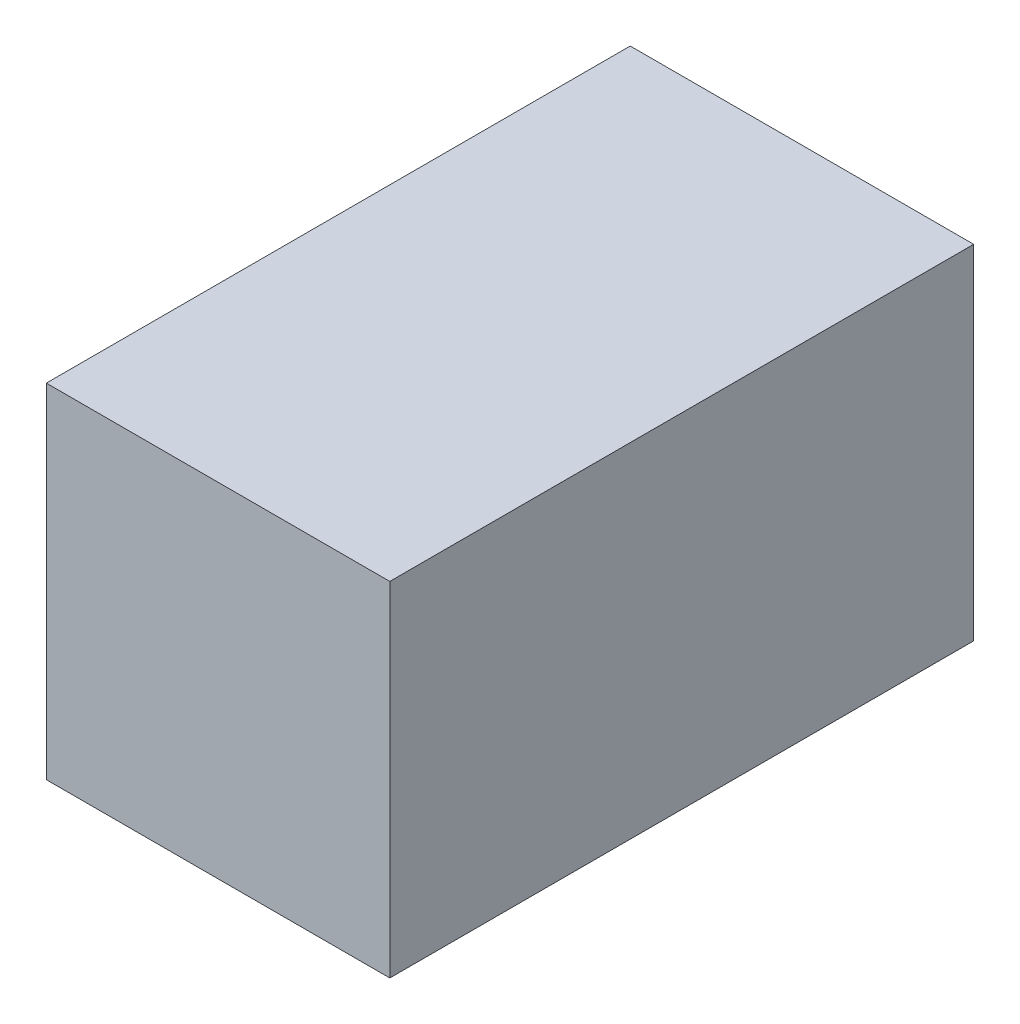
ISO-10303-21;
HEADER;
FILE_DESCRIPTION(('STEP AP214'),'2;1');
FILE_NAME('part.step','',(''),(''),'','','');
FILE_SCHEMA(('AUTOMOTIVE_DESIGN { 1 0 10303 214 1 1 1 1 }'));
ENDSEC;
DATA;
#1=APPLICATION_CONTEXT('core data for automotive mechanical design processes');
#2=APPLICATION_PROTOCOL_DEFINITION('international standard','automotive_design',2000,#1);
#3=PRODUCT_CONTEXT('',#1,'mechanical');
#4=PRODUCT('Part','Part','',(#3));
#5=PRODUCT_RELATED_PRODUCT_CATEGORY('part','',(#4));
#6=PRODUCT_DEFINITION_FORMATION('','',#4);
#7=PRODUCT_DEFINITION_CONTEXT('part definition',#1,'design');
#8=PRODUCT_DEFINITION('design','',#6,#7);
#9=PRODUCT_DEFINITION_SHAPE('','',#8);
#10=(LENGTH_UNIT() NAMED_UNIT(*) SI_UNIT(.MILLI.,.METRE.));
#11=(NAMED_UNIT(*) PLANE_ANGLE_UNIT() SI_UNIT($,.RADIAN.));
#12=(NAMED_UNIT(*) SI_UNIT($,.STERADIAN.) SOLID_ANGLE_UNIT());
#13=UNCERTAINTY_MEASURE_WITH_UNIT(LENGTH_MEASURE(1.E-05),#10,'distance_accuracy_value','');
#14=(GEOMETRIC_REPRESENTATION_CONTEXT(3) GLOBAL_UNCERTAINTY_ASSIGNED_CONTEXT((#13)) GLOBAL_UNIT_ASSIGNED_CONTEXT((#10,
#11,#12)) REPRESENTATION_CONTEXT('',''));
#15=CARTESIAN_POINT('',(0.,0.,0.));
#16=DIRECTION('',(0.,0.,1.));
#17=DIRECTION('',(1.,0.,0.));
#18=AXIS2_PLACEMENT_3D('',#15,#16,#17);
#19=CARTESIAN_POINT('',(0.,0.,-7.));
#20=DIRECTION('',(-1.,0.,0.));
#21=DIRECTION('',(0.,0.,1.));
#22=AXIS2_PLACEMENT_3D('',#19,#20,#21);
#23=PLANE('',#22);
#24=DIRECTION('',(0.,0.,1.));
#25=VECTOR('',#24,1.);
#26=CARTESIAN_POINT('',(0.,0.,-7.));
#27=LINE('',#26,#25);
#28=CARTESIAN_POINT('',(0.,0.,-7.));
#29=VERTEX_POINT('',#28);
#30=CARTESIAN_POINT('',(0.,0.,10.));
#31=VERTEX_POINT('',#30);
#32=EDGE_CURVE('E42',#29,#31,#27,.T.);
#33=ORIENTED_EDGE('',*,*,#32,.T.);
#34=DIRECTION('',(0.,-1.,0.));
#35=VECTOR('',#34,1.);
#36=CARTESIAN_POINT('',(0.,0.,10.));
#37=LINE('',#36,#35);
#38=CARTESIAN_POINT('',(0.,10.,10.));
#39=VERTEX_POINT('',#38);
#40=EDGE_CURVE('E82',#39,#31,#37,.T.);
#41=ORIENTED_EDGE('',*,*,#40,.F.);
#42=DIRECTION('',(0.,0.,1.));
#43=VECTOR('',#42,1.);
#44=CARTESIAN_POINT('',(0.,10.,-7.));
#45=LINE('',#44,#43);
#46=CARTESIAN_POINT('',(0.,10.,-7.));
#47=VERTEX_POINT('',#46);
#48=EDGE_CURVE('E11',#47,#39,#45,.T.);
#49=ORIENTED_EDGE('',*,*,#48,.F.);
#50=DIRECTION('',(0.,-1.,0.));
#51=VECTOR('',#50,1.);
#52=CARTESIAN_POINT('',(0.,0.,-7.));
#53=LINE('',#52,#51);
#54=EDGE_CURVE('E85',#47,#29,#53,.T.);
#55=ORIENTED_EDGE('',*,*,#54,.T.);
#56=EDGE_LOOP('',(#33,#41,#49,#55));
#57=FACE_BOUND('',#56,.T.);
#58=ADVANCED_FACE('F41',(#57),#23,.T.);
#59=CARTESIAN_POINT('',(0.,10.,-7.));
#60=DIRECTION('',(0.,1.,0.));
#61=DIRECTION('',(0.,0.,1.));
#62=AXIS2_PLACEMENT_3D('',#59,#60,#61);
#63=PLANE('',#62);
#64=ORIENTED_EDGE('',*,*,#48,.T.);
#65=DIRECTION('',(-1.,0.,0.));
#66=VECTOR('',#65,1.);
#67=CARTESIAN_POINT('',(0.,10.,10.));
#68=LINE('',#67,#66);
#69=CARTESIAN_POINT('',(10.,10.,10.));
#70=VERTEX_POINT('',#69);
#71=EDGE_CURVE('E98',#70,#39,#68,.T.);
#72=ORIENTED_EDGE('',*,*,#71,.F.);
#73=DIRECTION('',(0.,0.,1.));
#74=VECTOR('',#73,1.);
#75=CARTESIAN_POINT('',(10.,10.,-7.));
#76=LINE('',#75,#74);
#77=CARTESIAN_POINT('',(10.,10.,-7.));
#78=VERTEX_POINT('',#77);
#79=EDGE_CURVE('E47',#78,#70,#76,.T.);
#80=ORIENTED_EDGE('',*,*,#79,.F.);
#81=DIRECTION('',(-1.,0.,0.));
#82=VECTOR('',#81,1.);
#83=CARTESIAN_POINT('',(0.,10.,-7.));
#84=LINE('',#83,#82);
#85=EDGE_CURVE('E87',#78,#47,#84,.T.);
#86=ORIENTED_EDGE('',*,*,#85,.T.);
#87=EDGE_LOOP('',(#64,#72,#80,#86));
#88=FACE_BOUND('',#87,.T.);
#89=ADVANCED_FACE('F114',(#88),#63,.T.);
#90=CARTESIAN_POINT('',(10.,0.,-7.));
#91=DIRECTION('',(1.,0.,0.));
#92=DIRECTION('',(0.,0.,-1.));
#93=AXIS2_PLACEMENT_3D('',#90,#91,#92);
#94=PLANE('',#93);
#95=ORIENTED_EDGE('',*,*,#79,.T.);
#96=DIRECTION('',(0.,1.,0.));
#97=VECTOR('',#96,1.);
#98=CARTESIAN_POINT('',(10.,0.,10.));
#99=LINE('',#98,#97);
#100=CARTESIAN_POINT('',(10.,0.,10.));
#101=VERTEX_POINT('',#100);
#102=EDGE_CURVE('E94',#101,#70,#99,.T.);
#103=ORIENTED_EDGE('',*,*,#102,.F.);
#104=DIRECTION('',(0.,0.,1.));
#105=VECTOR('',#104,1.);
#106=CARTESIAN_POINT('',(10.,0.,-7.));
#107=LINE('',#106,#105);
#108=CARTESIAN_POINT('',(10.,0.,-7.));
#109=VERTEX_POINT('',#108);
#110=EDGE_CURVE('E88',#109,#101,#107,.T.);
#111=ORIENTED_EDGE('',*,*,#110,.F.);
#112=DIRECTION('',(0.,1.,0.));
#113=VECTOR('',#112,1.);
#114=CARTESIAN_POINT('',(10.,0.,-7.));
#115=LINE('',#114,#113);
#116=EDGE_CURVE('E106',#109,#78,#115,.T.);
#117=ORIENTED_EDGE('',*,*,#116,.T.);
#118=EDGE_LOOP('',(#95,#103,#111,#117));
#119=FACE_BOUND('',#118,.T.);
#120=ADVANCED_FACE('F109',(#119),#94,.T.);
#121=CARTESIAN_POINT('',(0.,0.,-7.));
#122=DIRECTION('',(0.,-1.,0.));
#123=DIRECTION('',(0.,0.,-1.));
#124=AXIS2_PLACEMENT_3D('',#121,#122,#123);
#125=PLANE('',#124);
#126=ORIENTED_EDGE('',*,*,#110,.T.);
#127=DIRECTION('',(1.,0.,0.));
#128=VECTOR('',#127,1.);
#129=CARTESIAN_POINT('',(0.,0.,10.));
#130=LINE('',#129,#128);
#131=EDGE_CURVE('E90',#31,#101,#130,.T.);
#132=ORIENTED_EDGE('',*,*,#131,.F.);
#133=ORIENTED_EDGE('',*,*,#32,.F.);
#134=DIRECTION('',(1.,0.,0.));
#135=VECTOR('',#134,1.);
#136=CARTESIAN_POINT('',(0.,0.,-7.));
#137=LINE('',#136,#135);
#138=EDGE_CURVE('E102',#29,#109,#137,.T.);
#139=ORIENTED_EDGE('',*,*,#138,.T.);
#140=EDGE_LOOP('',(#126,#132,#133,#139));
#141=FACE_BOUND('',#140,.T.);
#142=ADVANCED_FACE('F89',(#141),#125,.T.);
#143=CARTESIAN_POINT('',(0.,0.,-7.));
#144=DIRECTION('',(0.,0.,-1.));
#145=DIRECTION('',(-1.,0.,0.));
#146=AXIS2_PLACEMENT_3D('',#143,#144,#145);
#147=PLANE('',#146);
#148=ORIENTED_EDGE('',*,*,#54,.F.);
#149=ORIENTED_EDGE('',*,*,#85,.F.);
#150=ORIENTED_EDGE('',*,*,#116,.F.);
#151=ORIENTED_EDGE('',*,*,#138,.F.);
#152=EDGE_LOOP('',(#148,#149,#150,#151));
#153=FACE_BOUND('',#152,.T.);
#154=ADVANCED_FACE('F113',(#153),#147,.T.);
#155=CARTESIAN_POINT('',(0.,0.,10.));
#156=DIRECTION('',(0.,0.,-1.));
#157=DIRECTION('',(-1.,0.,0.));
#158=AXIS2_PLACEMENT_3D('',#155,#156,#157);
#159=PLANE('',#158);
#160=ORIENTED_EDGE('',*,*,#40,.T.);
#161=ORIENTED_EDGE('',*,*,#131,.T.);
#162=ORIENTED_EDGE('',*,*,#102,.T.);
#163=ORIENTED_EDGE('',*,*,#71,.T.);
#164=EDGE_LOOP('',(#160,#161,#162,#163));
#165=FACE_BOUND('',#164,.T.);
#166=ADVANCED_FACE('F100',(#165),#159,.F.);
#167=CLOSED_SHELL('',(#58,#89,#120,#142,#154,#166));
#168=MANIFOLD_SOLID_BREP('B2',#167);
#169=ADVANCED_BREP_SHAPE_REPRESENTATION('',(#18,#168),#14);
#170=SHAPE_DEFINITION_REPRESENTATION(#9,#169);
ENDSEC;
END-ISO-10303-21;
